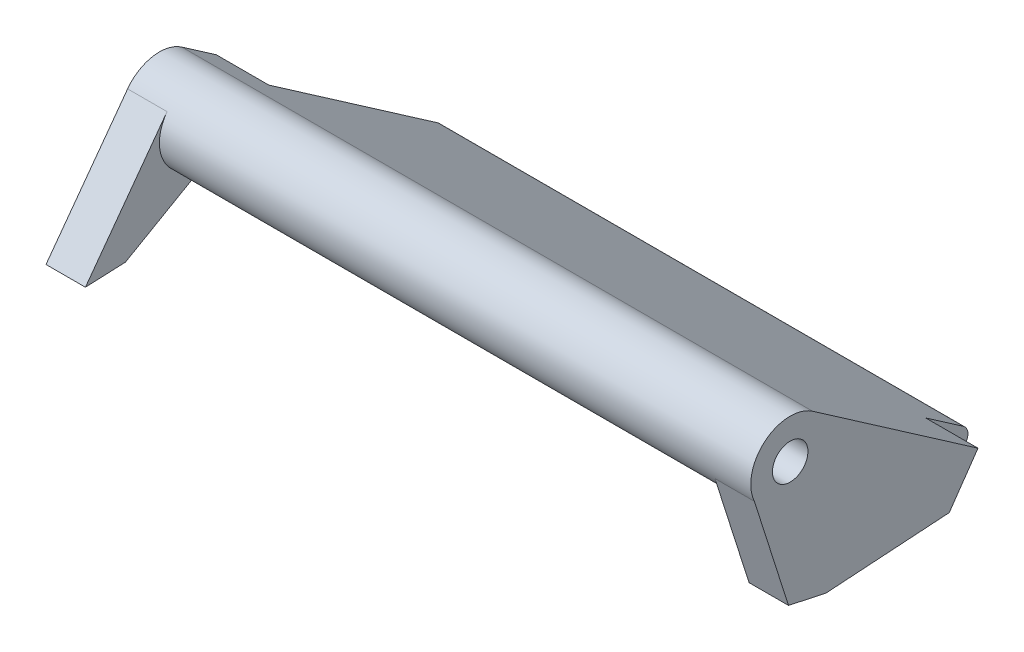
ISO-10303-21;
HEADER;
FILE_DESCRIPTION(('STEP AP214'),'2;1');
FILE_NAME('part.step','',(''),(''),'','','');
FILE_SCHEMA(('AUTOMOTIVE_DESIGN { 1 0 10303 214 1 1 1 1 }'));
ENDSEC;
DATA;
#1=APPLICATION_CONTEXT('core data for automotive mechanical design processes');
#2=APPLICATION_PROTOCOL_DEFINITION('international standard','automotive_design',2000,#1);
#3=PRODUCT_CONTEXT('',#1,'mechanical');
#4=PRODUCT('Part','Part','',(#3));
#5=PRODUCT_RELATED_PRODUCT_CATEGORY('part','',(#4));
#6=PRODUCT_DEFINITION_FORMATION('','',#4);
#7=PRODUCT_DEFINITION_CONTEXT('part definition',#1,'design');
#8=PRODUCT_DEFINITION('design','',#6,#7);
#9=PRODUCT_DEFINITION_SHAPE('','',#8);
#10=(LENGTH_UNIT() NAMED_UNIT(*) SI_UNIT(.MILLI.,.METRE.));
#11=(NAMED_UNIT(*) PLANE_ANGLE_UNIT() SI_UNIT($,.RADIAN.));
#12=(NAMED_UNIT(*) SI_UNIT($,.STERADIAN.) SOLID_ANGLE_UNIT());
#13=UNCERTAINTY_MEASURE_WITH_UNIT(LENGTH_MEASURE(1.E-05),#10,'distance_accuracy_value','');
#14=(GEOMETRIC_REPRESENTATION_CONTEXT(3) GLOBAL_UNCERTAINTY_ASSIGNED_CONTEXT((#13)) GLOBAL_UNIT_ASSIGNED_CONTEXT((#10,
#11,#12)) REPRESENTATION_CONTEXT('',''));
#15=CARTESIAN_POINT('',(0.,0.,0.));
#16=DIRECTION('',(0.,0.,1.));
#17=DIRECTION('',(1.,0.,0.));
#18=AXIS2_PLACEMENT_3D('',#15,#16,#17);
#19=CARTESIAN_POINT('',(10.0025786827693,10.,-13.1500803493484));
#20=DIRECTION('',(1.,0.,0.));
#21=DIRECTION('',(0.,0.,-1.));
#22=AXIS2_PLACEMENT_3D('',#19,#20,#21);
#23=PLANE('',#22);
#24=DIRECTION('',(0.,-0.56983363286526,-0.821760081079374));
#25=VECTOR('',#24,1.);
#26=CARTESIAN_POINT('',(10.0025786827693,1.23264012161906,-0.85475044929789));
#27=LINE('',#26,#25);
#28=CARTESIAN_POINT('',(10.0025786827693,-3.12994978908771,-7.14606432052765));
#29=VERTEX_POINT('',#28);
#30=CARTESIAN_POINT('',(10.0025786827693,-4.13032285767228,-8.58870758785487));
#31=VERTEX_POINT('',#30);
#32=EDGE_CURVE('E64',#29,#31,#27,.T.);
#33=ORIENTED_EDGE('',*,*,#32,.F.);
#34=DIRECTION('',(0.,0.821760081079374,-0.56983363286526));
#35=VECTOR('',#34,1.);
#36=CARTESIAN_POINT('',(10.0025786827693,-4.70678049005269,-6.05264157168332));
#37=LINE('',#36,#35);
#38=CARTESIAN_POINT('',(10.0025786827693,-3.74959196427246,-6.71638543992509));
#39=VERTEX_POINT('',#38);
#40=EDGE_CURVE('E68',#39,#29,#37,.T.);
#41=ORIENTED_EDGE('',*,*,#40,.F.);
#42=DIRECTION('',(0.,0.56983363286526,0.821760081079374));
#43=VECTOR('',#42,1.);
#44=CARTESIAN_POINT('',(10.0025786827693,0.612997946434314,-0.425071568695328));
#45=LINE('',#44,#43);
#46=CARTESIAN_POINT('',(10.0025786827693,-4.74996503285703,-8.15902870725231));
#47=VERTEX_POINT('',#46);
#48=EDGE_CURVE('E315',#47,#39,#45,.T.);
#49=ORIENTED_EDGE('',*,*,#48,.F.);
#50=CARTESIAN_POINT('',(10.0025786827693,-4.42126100042528,-8.38696216039841));
#51=DIRECTION('',(1.,0.,0.));
#52=DIRECTION('',(0.,0.,-1.));
#53=AXIS2_PLACEMENT_3D('',#50,#51,#52);
#54=CIRCLE('',#53,0.4);
#55=CARTESIAN_POINT('',(10.0025786827693,-4.66770098402796,-8.70202935082278));
#56=VERTEX_POINT('',#55);
#57=EDGE_CURVE('E57',#47,#56,#54,.T.);
#58=ORIENTED_EDGE('',*,*,#57,.T.);
#59=CARTESIAN_POINT('',(10.0025786827693,-4.45902689010403,-8.36077413470877));
#60=DIRECTION('',(1.,0.,0.));
#61=DIRECTION('',(0.,0.,-1.));
#62=AXIS2_PLACEMENT_3D('',#59,#60,#61);
#63=CIRCLE('',#62,0.4);
#64=EDGE_CURVE('E366',#56,#31,#63,.T.);
#65=ORIENTED_EDGE('',*,*,#64,.T.);
#66=EDGE_LOOP('',(#33,#41,#49,#58,#65));
#67=FACE_BOUND('',#66,.T.);
#68=ADVANCED_FACE('F47',(#67),#23,.T.);
#69=CARTESIAN_POINT('',(12.,0.612997946434314,-0.425071568695328));
#70=DIRECTION('',(0.,-0.821760081079374,0.56983363286526));
#71=DIRECTION('',(0.,-0.56983363286526,-0.821760081079374));
#72=AXIS2_PLACEMENT_3D('',#69,#70,#71);
#73=PLANE('',#72);
#74=DIRECTION('',(1.,0.,0.));
#75=VECTOR('',#74,1.);
#76=CARTESIAN_POINT('',(12.,-0.593999427107595,-2.16568883369787));
#77=LINE('',#76,#75);
#78=CARTESIAN_POINT('',(10.0025786827693,-0.593999427107595,-2.16568883369787));
#79=VERTEX_POINT('',#78);
#80=CARTESIAN_POINT('',(10.5,-0.593999427107594,-2.16568883369787));
#81=VERTEX_POINT('',#80);
#82=EDGE_CURVE('E311',#79,#81,#77,.T.);
#83=ORIENTED_EDGE('',*,*,#82,.T.);
#84=DIRECTION('',(0.,0.56983363286526,0.821760081079375));
#85=VECTOR('',#84,1.);
#86=CARTESIAN_POINT('',(10.5,-0.128562902088475,-1.49448037130188));
#87=LINE('',#86,#85);
#88=CARTESIAN_POINT('',(10.5,-0.128562902088475,-1.49448037130188));
#89=VERTEX_POINT('',#88);
#90=EDGE_CURVE('E235',#81,#89,#87,.T.);
#91=ORIENTED_EDGE('',*,*,#90,.T.);
#92=DIRECTION('',(-1.,0.,0.));
#93=VECTOR('',#92,1.);
#94=CARTESIAN_POINT('',(12.,-0.128562902088475,-1.49448037130188));
#95=LINE('',#94,#93);
#96=CARTESIAN_POINT('',(-12.,-0.128562902088475,-1.49448037130188));
#97=VERTEX_POINT('',#96);
#98=EDGE_CURVE('E334',#89,#97,#95,.T.);
#99=ORIENTED_EDGE('',*,*,#98,.T.);
#100=DIRECTION('',(0.,0.56983363286526,0.821760081079374));
#101=VECTOR('',#100,1.);
#102=CARTESIAN_POINT('',(-12.,0.612997946434314,-0.425071568695328));
#103=LINE('',#102,#101);
#104=CARTESIAN_POINT('',(-12.,-0.593999427107594,-2.16568883369787));
#105=VERTEX_POINT('',#104);
#106=EDGE_CURVE('E342',#105,#97,#103,.T.);
#107=ORIENTED_EDGE('',*,*,#106,.F.);
#108=DIRECTION('',(1.,0.,0.));
#109=VECTOR('',#108,1.);
#110=CARTESIAN_POINT('',(12.,-0.5939994271076,-2.16568883369788));
#111=LINE('',#110,#109);
#112=CARTESIAN_POINT('',(-10.0025786827693,-0.593999427107593,-2.16568883369787));
#113=VERTEX_POINT('',#112);
#114=EDGE_CURVE('E303',#105,#113,#111,.T.);
#115=ORIENTED_EDGE('',*,*,#114,.T.);
#116=DIRECTION('',(0.,-0.56983363286526,-0.821760081079374));
#117=VECTOR('',#116,1.);
#118=CARTESIAN_POINT('',(-10.0025786827693,0.612997946434316,-0.425071568695325));
#119=LINE('',#118,#117);
#120=CARTESIAN_POINT('',(-10.0025786827693,-4.74996503285703,-8.15902870725231));
#121=VERTEX_POINT('',#120);
#122=EDGE_CURVE('E320',#113,#121,#119,.T.);
#123=ORIENTED_EDGE('',*,*,#122,.T.);
#124=DIRECTION('',(-1.,0.,0.));
#125=VECTOR('',#124,1.);
#126=CARTESIAN_POINT('',(12.,-4.74996503285703,-8.15902870725231));
#127=LINE('',#126,#125);
#128=EDGE_CURVE('E362',#121,#47,#127,.F.);
#129=ORIENTED_EDGE('',*,*,#128,.T.);
#130=ORIENTED_EDGE('',*,*,#48,.T.);
#131=DIRECTION('',(0.,0.56983363286526,0.821760081079374));
#132=VECTOR('',#131,1.);
#133=CARTESIAN_POINT('',(10.0025786827693,0.612997946434314,-0.425071568695328));
#134=LINE('',#133,#132);
#135=EDGE_CURVE('E203',#39,#79,#134,.T.);
#136=ORIENTED_EDGE('',*,*,#135,.T.);
#137=EDGE_LOOP('',(#83,#91,#99,#107,#115,#123,#129,#130,#136));
#138=FACE_BOUND('',#137,.T.);
#139=ADVANCED_FACE('F394',(#138),#73,.T.);
#140=CARTESIAN_POINT('',(12.,0.,0.));
#141=DIRECTION('',(-1.,0.,0.));
#142=DIRECTION('',(0.,0.,1.));
#143=AXIS2_PLACEMENT_3D('',#140,#141,#142);
#144=CYLINDRICAL_SURFACE('',#143,1.5);
#145=CARTESIAN_POINT('',(10.5,0.,0.));
#146=DIRECTION('',(-1.,0.,0.));
#147=DIRECTION('',(0.,0.,-1.));
#148=AXIS2_PLACEMENT_3D('',#145,#146,#147);
#149=CIRCLE('',#148,1.5);
#150=CARTESIAN_POINT('',(10.5,-0.629342863678596,1.36159008513459));
#151=VERTEX_POINT('',#150);
#152=EDGE_CURVE('E216',#89,#151,#149,.T.);
#153=ORIENTED_EDGE('',*,*,#152,.T.);
#154=DIRECTION('',(1.,0.,0.));
#155=VECTOR('',#154,1.);
#156=CARTESIAN_POINT('',(10.5,-0.629342863678596,1.36159008513459));
#157=LINE('',#156,#155);
#158=CARTESIAN_POINT('',(12.,-0.629342863678601,1.36159008513459));
#159=VERTEX_POINT('',#158);
#160=EDGE_CURVE('E238',#151,#159,#157,.T.);
#161=ORIENTED_EDGE('',*,*,#160,.T.);
#162=CARTESIAN_POINT('',(12.,0.,0.));
#163=DIRECTION('',(1.,0.,0.));
#164=DIRECTION('',(0.,0.,-1.));
#165=AXIS2_PLACEMENT_3D('',#162,#163,#164);
#166=CIRCLE('',#165,1.5);
#167=CARTESIAN_POINT('',(12.,1.23264012161906,-0.85475044929789));
#168=VERTEX_POINT('',#167);
#169=EDGE_CURVE('E183',#168,#159,#166,.T.);
#170=ORIENTED_EDGE('',*,*,#169,.F.);
#171=DIRECTION('',(-1.,0.,0.));
#172=VECTOR('',#171,1.);
#173=CARTESIAN_POINT('',(12.,1.23264012161906,-0.85475044929789));
#174=LINE('',#173,#172);
#175=CARTESIAN_POINT('',(-12.,1.23264012161906,-0.85475044929789));
#176=VERTEX_POINT('',#175);
#177=EDGE_CURVE('E177',#168,#176,#174,.T.);
#178=ORIENTED_EDGE('',*,*,#177,.T.);
#179=CARTESIAN_POINT('',(-12.,0.,0.));
#180=DIRECTION('',(1.,0.,0.));
#181=DIRECTION('',(0.,0.,-1.));
#182=AXIS2_PLACEMENT_3D('',#179,#180,#181);
#183=CIRCLE('',#182,1.5);
#184=CARTESIAN_POINT('',(-12.,0.887142062973357,1.20953667166538));
#185=VERTEX_POINT('',#184);
#186=EDGE_CURVE('E339',#176,#185,#183,.T.);
#187=ORIENTED_EDGE('',*,*,#186,.T.);
#188=DIRECTION('',(-1.,0.,0.));
#189=VECTOR('',#188,1.);
#190=CARTESIAN_POINT('',(-10.5,0.887142062973357,1.20953667166539));
#191=LINE('',#190,#189);
#192=CARTESIAN_POINT('',(-10.5,0.887142062973357,1.20953667166539));
#193=VERTEX_POINT('',#192);
#194=EDGE_CURVE('E286',#193,#185,#191,.T.);
#195=ORIENTED_EDGE('',*,*,#194,.F.);
#196=CARTESIAN_POINT('',(-10.5,0.,0.));
#197=DIRECTION('',(1.,0.,0.));
#198=DIRECTION('',(0.,0.,1.));
#199=AXIS2_PLACEMENT_3D('',#196,#197,#198);
#200=CIRCLE('',#199,1.5);
#201=CARTESIAN_POINT('',(-10.5,-1.4412068388642,-0.41583993027494));
#202=VERTEX_POINT('',#201);
#203=EDGE_CURVE('E258',#193,#202,#200,.T.);
#204=ORIENTED_EDGE('',*,*,#203,.T.);
#205=DIRECTION('',(-1.,0.,0.));
#206=VECTOR('',#205,1.);
#207=CARTESIAN_POINT('',(-10.5,-1.4412068388642,-0.41583993027494));
#208=LINE('',#207,#206);
#209=CARTESIAN_POINT('',(-12.,-1.4412068388642,-0.41583993027494));
#210=VERTEX_POINT('',#209);
#211=EDGE_CURVE('E274',#202,#210,#208,.T.);
#212=ORIENTED_EDGE('',*,*,#211,.T.);
#213=EDGE_CURVE('E338',#210,#97,#183,.T.);
#214=ORIENTED_EDGE('',*,*,#213,.T.);
#215=ORIENTED_EDGE('',*,*,#98,.F.);
#216=EDGE_LOOP('',(#153,#161,#170,#178,#187,#195,#204,#212,#214,#215));
#217=FACE_BOUND('',#216,.T.);
#218=ADVANCED_FACE('F385',(#217),#144,.T.);
#219=CARTESIAN_POINT('',(12.,1.23264012161906,-0.85475044929789));
#220=DIRECTION('',(0.,0.821760081079374,-0.56983363286526));
#221=DIRECTION('',(0.,0.56983363286526,0.821760081079374));
#222=AXIS2_PLACEMENT_3D('',#219,#220,#221);
#223=PLANE('',#222);
#224=DIRECTION('',(-1.,0.,0.));
#225=VECTOR('',#224,1.);
#226=CARTESIAN_POINT('',(19.0787583757015,-3.12994978908771,-7.14606432052765));
#227=LINE('',#226,#225);
#228=CARTESIAN_POINT('',(12.,-3.12994978908771,-7.14606432052765));
#229=VERTEX_POINT('',#228);
#230=EDGE_CURVE('E175',#229,#29,#227,.T.);
#231=ORIENTED_EDGE('',*,*,#230,.T.);
#232=ORIENTED_EDGE('',*,*,#32,.T.);
#233=DIRECTION('',(-1.,0.,0.));
#234=VECTOR('',#233,1.);
#235=CARTESIAN_POINT('',(12.,-4.13032285767228,-8.58870758785487));
#236=LINE('',#235,#234);
#237=CARTESIAN_POINT('',(-10.0025786827693,-4.13032285767228,-8.58870758785487));
#238=VERTEX_POINT('',#237);
#239=EDGE_CURVE('E11',#31,#238,#236,.T.);
#240=ORIENTED_EDGE('',*,*,#239,.T.);
#241=DIRECTION('',(0.,0.56983363286526,0.821760081079374));
#242=VECTOR('',#241,1.);
#243=CARTESIAN_POINT('',(-10.0025786827693,1.23264012161906,-0.854750449297888));
#244=LINE('',#243,#242);
#245=CARTESIAN_POINT('',(-10.0025786827693,0.323595256524185,-2.16568883369787));
#246=VERTEX_POINT('',#245);
#247=EDGE_CURVE('E324',#238,#246,#244,.T.);
#248=ORIENTED_EDGE('',*,*,#247,.T.);
#249=DIRECTION('',(-1.,0.,0.));
#250=VECTOR('',#249,1.);
#251=CARTESIAN_POINT('',(12.,0.32359525652418,-2.16568883369788));
#252=LINE('',#251,#250);
#253=CARTESIAN_POINT('',(-12.,0.323595256524186,-2.16568883369787));
#254=VERTEX_POINT('',#253);
#255=EDGE_CURVE('E307',#246,#254,#252,.T.);
#256=ORIENTED_EDGE('',*,*,#255,.T.);
#257=DIRECTION('',(0.,-0.56983363286526,-0.821760081079374));
#258=VECTOR('',#257,1.);
#259=CARTESIAN_POINT('',(-12.,1.23264012161906,-0.85475044929789));
#260=LINE('',#259,#258);
#261=EDGE_CURVE('E326',#176,#254,#260,.T.);
#262=ORIENTED_EDGE('',*,*,#261,.F.);
#263=ORIENTED_EDGE('',*,*,#177,.F.);
#264=DIRECTION('',(0.,-0.56983363286526,-0.821760081079374));
#265=VECTOR('',#264,1.);
#266=CARTESIAN_POINT('',(12.,1.23264012161906,-0.85475044929789));
#267=LINE('',#266,#265);
#268=EDGE_CURVE('E172',#168,#229,#267,.T.);
#269=ORIENTED_EDGE('',*,*,#268,.T.);
#270=EDGE_LOOP('',(#231,#232,#240,#248,#256,#262,#263,#269));
#271=FACE_BOUND('',#270,.T.);
#272=ADVANCED_FACE('F174',(#271),#223,.T.);
#273=CARTESIAN_POINT('',(12.,0.,0.));
#274=DIRECTION('',(1.,0.,0.));
#275=DIRECTION('',(0.,0.,-1.));
#276=AXIS2_PLACEMENT_3D('',#273,#274,#275);
#277=PLANE('',#276);
#278=DIRECTION('',(0.,0.821760081079374,-0.56983363286526));
#279=VECTOR('',#278,1.);
#280=CARTESIAN_POINT('',(12.,-4.70678049005269,-6.05264157168332));
#281=LINE('',#280,#279);
#282=CARTESIAN_POINT('',(12.,-4.70678049005269,-6.05264157168332));
#283=VERTEX_POINT('',#282);
#284=EDGE_CURVE('E190',#283,#229,#281,.T.);
#285=ORIENTED_EDGE('',*,*,#284,.T.);
#286=ORIENTED_EDGE('',*,*,#268,.F.);
#287=ORIENTED_EDGE('',*,*,#169,.T.);
#288=DIRECTION('',(0.,-0.952962001158608,-0.303089795848989));
#289=VECTOR('',#288,1.);
#290=CARTESIAN_POINT('',(12.,-0.629342863678596,1.36159008513459));
#291=LINE('',#290,#289);
#292=CARTESIAN_POINT('',(12.,-4.70678049005269,0.0647600580588064));
#293=VERTEX_POINT('',#292);
#294=EDGE_CURVE('E207',#159,#293,#291,.T.);
#295=ORIENTED_EDGE('',*,*,#294,.T.);
#296=DIRECTION('',(0.,-0.211123507645692,-0.9774593927726));
#297=VECTOR('',#296,1.);
#298=CARTESIAN_POINT('',(12.,-4.70678049005269,0.0647600580588064));
#299=LINE('',#298,#297);
#300=CARTESIAN_POINT('',(12.,-5.01416057726156,-1.35834794513801));
#301=VERTEX_POINT('',#300);
#302=EDGE_CURVE('E242',#293,#301,#299,.T.);
#303=ORIENTED_EDGE('',*,*,#302,.T.);
#304=DIRECTION('',(0.,0.0653395945464725,-0.997863085490441));
#305=VECTOR('',#304,1.);
#306=CARTESIAN_POINT('',(12.,-4.70678049005269,-6.05264157168332));
#307=LINE('',#306,#305);
#308=EDGE_CURVE('E201',#301,#283,#307,.T.);
#309=ORIENTED_EDGE('',*,*,#308,.T.);
#310=EDGE_LOOP('',(#285,#286,#287,#295,#303,#309));
#311=FACE_BOUND('',#310,.T.);
#312=CARTESIAN_POINT('',(12.,0.,0.));
#313=DIRECTION('',(1.,0.,0.));
#314=DIRECTION('',(0.,0.,-1.));
#315=AXIS2_PLACEMENT_3D('',#312,#313,#314);
#316=CIRCLE('',#315,0.675);
#317=CARTESIAN_POINT('',(12.,0.,-0.675));
#318=VERTEX_POINT('',#317);
#319=EDGE_CURVE('E330',#318,#318,#316,.T.);
#320=ORIENTED_EDGE('',*,*,#319,.F.);
#321=EDGE_LOOP('',(#320));
#322=FACE_BOUND('',#321,.T.);
#323=ADVANCED_FACE('F197',(#311,#322),#277,.T.);
#324=CARTESIAN_POINT('',(-12.,0.,0.));
#325=DIRECTION('',(1.,0.,0.));
#326=DIRECTION('',(0.,0.,-1.));
#327=AXIS2_PLACEMENT_3D('',#324,#325,#326);
#328=PLANE('',#327);
#329=CARTESIAN_POINT('',(-12.,0.,0.));
#330=DIRECTION('',(1.,0.,0.));
#331=DIRECTION('',(0.,0.,-1.));
#332=AXIS2_PLACEMENT_3D('',#329,#330,#331);
#333=CIRCLE('',#332,0.675);
#334=CARTESIAN_POINT('',(-12.,0.,-0.675));
#335=VERTEX_POINT('',#334);
#336=EDGE_CURVE('E184',#335,#335,#333,.T.);
#337=ORIENTED_EDGE('',*,*,#336,.T.);
#338=EDGE_LOOP('',(#337));
#339=FACE_BOUND('',#338,.T.);
#340=DIRECTION('',(0.,1.,0.));
#341=VECTOR('',#340,1.);
#342=CARTESIAN_POINT('',(-12.,0.,-2.16568883369787));
#343=LINE('',#342,#341);
#344=EDGE_CURVE('E353',#105,#254,#343,.T.);
#345=ORIENTED_EDGE('',*,*,#344,.F.);
#346=ORIENTED_EDGE('',*,*,#106,.T.);
#347=ORIENTED_EDGE('',*,*,#213,.F.);
#348=DIRECTION('',(0.,-0.497738893826087,0.86732692427526));
#349=VECTOR('',#348,1.);
#350=CARTESIAN_POINT('',(-12.,-3.28158078622837,2.79107416682073));
#351=LINE('',#350,#349);
#352=CARTESIAN_POINT('',(-12.,-3.28158078622837,2.79107416682073));
#353=VERTEX_POINT('',#352);
#354=EDGE_CURVE('E275',#210,#353,#351,.T.);
#355=ORIENTED_EDGE('',*,*,#354,.T.);
#356=DIRECTION('',(0.,-0.0428582006303218,0.999081165190662));
#357=VECTOR('',#356,1.);
#358=CARTESIAN_POINT('',(-12.,-3.34695622908927,4.31506193736941));
#359=LINE('',#358,#357);
#360=CARTESIAN_POINT('',(-12.,-3.34695622908927,4.31506193736941));
#361=VERTEX_POINT('',#360);
#362=EDGE_CURVE('E279',#353,#361,#359,.T.);
#363=ORIENTED_EDGE('',*,*,#362,.T.);
#364=DIRECTION('',(0.,0.806357781110256,-0.591428041982238));
#365=VECTOR('',#364,1.);
#366=CARTESIAN_POINT('',(-12.,0.887142062973357,1.20953667166539));
#367=LINE('',#366,#365);
#368=EDGE_CURVE('E262',#361,#185,#367,.T.);
#369=ORIENTED_EDGE('',*,*,#368,.T.);
#370=ORIENTED_EDGE('',*,*,#186,.F.);
#371=ORIENTED_EDGE('',*,*,#261,.T.);
#372=EDGE_LOOP('',(#345,#346,#347,#355,#363,#369,#370,#371));
#373=FACE_BOUND('',#372,.T.);
#374=ADVANCED_FACE('F392',(#339,#373),#328,.F.);
#375=CARTESIAN_POINT('',(12.,0.,0.));
#376=DIRECTION('',(-1.,0.,0.));
#377=DIRECTION('',(0.,0.,1.));
#378=AXIS2_PLACEMENT_3D('',#375,#376,#377);
#379=CYLINDRICAL_SURFACE('',#378,0.675);
#380=ORIENTED_EDGE('',*,*,#319,.T.);
#381=EDGE_LOOP('',(#380));
#382=FACE_BOUND('',#381,.T.);
#383=ORIENTED_EDGE('',*,*,#336,.F.);
#384=EDGE_LOOP('',(#383));
#385=FACE_BOUND('',#384,.T.);
#386=ADVANCED_FACE('F448',(#382,#385),#379,.F.);
#387=CARTESIAN_POINT('',(-10.0025786827693,10.,-2.16568883369787));
#388=DIRECTION('',(0.,0.,-1.));
#389=DIRECTION('',(-1.,0.,0.));
#390=AXIS2_PLACEMENT_3D('',#387,#388,#389);
#391=PLANE('',#390);
#392=DIRECTION('',(0.,-1.,0.));
#393=VECTOR('',#392,1.);
#394=CARTESIAN_POINT('',(-10.0025786827693,10.,-2.16568883369787));
#395=LINE('',#394,#393);
#396=EDGE_CURVE('E290',#246,#113,#395,.T.);
#397=ORIENTED_EDGE('',*,*,#396,.T.);
#398=ORIENTED_EDGE('',*,*,#114,.F.);
#399=ORIENTED_EDGE('',*,*,#344,.T.);
#400=ORIENTED_EDGE('',*,*,#255,.F.);
#401=EDGE_LOOP('',(#397,#398,#399,#400));
#402=FACE_BOUND('',#401,.T.);
#403=ADVANCED_FACE('F412',(#402),#391,.T.);
#404=CARTESIAN_POINT('',(-10.0025786827693,10.,-13.1500803493484));
#405=DIRECTION('',(-1.,0.,0.));
#406=DIRECTION('',(0.,0.,1.));
#407=AXIS2_PLACEMENT_3D('',#404,#405,#406);
#408=PLANE('',#407);
#409=CARTESIAN_POINT('',(-10.0025786827693,-4.45902689010403,-8.36077413470877));
#410=DIRECTION('',(-1.,0.,0.));
#411=DIRECTION('',(0.,0.,1.));
#412=AXIS2_PLACEMENT_3D('',#409,#410,#411);
#413=CIRCLE('',#412,0.4);
#414=CARTESIAN_POINT('',(-10.0025786827693,-4.66770098402796,-8.70202935082278));
#415=VERTEX_POINT('',#414);
#416=EDGE_CURVE('E356',#238,#415,#413,.T.);
#417=ORIENTED_EDGE('',*,*,#416,.T.);
#418=CARTESIAN_POINT('',(-10.0025786827693,-4.42126100042528,-8.38696216039841));
#419=DIRECTION('',(-1.,0.,0.));
#420=DIRECTION('',(0.,0.,1.));
#421=AXIS2_PLACEMENT_3D('',#418,#419,#420);
#422=CIRCLE('',#421,0.4);
#423=EDGE_CURVE('E359',#415,#121,#422,.T.);
#424=ORIENTED_EDGE('',*,*,#423,.T.);
#425=ORIENTED_EDGE('',*,*,#122,.F.);
#426=ORIENTED_EDGE('',*,*,#396,.F.);
#427=ORIENTED_EDGE('',*,*,#247,.F.);
#428=EDGE_LOOP('',(#417,#424,#425,#426,#427));
#429=FACE_BOUND('',#428,.T.);
#430=ADVANCED_FACE('F414',(#429),#408,.T.);
#431=CARTESIAN_POINT('',(-10.5,0.887142062973357,1.20953667166539));
#432=DIRECTION('',(0.,0.591428041982238,0.806357781110256));
#433=DIRECTION('',(0.,-0.806357781110256,0.591428041982238));
#434=AXIS2_PLACEMENT_3D('',#431,#432,#433);
#435=PLANE('',#434);
#436=ORIENTED_EDGE('',*,*,#368,.F.);
#437=DIRECTION('',(-1.,0.,0.));
#438=VECTOR('',#437,1.);
#439=CARTESIAN_POINT('',(-10.5,-3.34695622908927,4.31506193736941));
#440=LINE('',#439,#438);
#441=CARTESIAN_POINT('',(-10.5,-3.34695622908927,4.31506193736941));
#442=VERTEX_POINT('',#441);
#443=EDGE_CURVE('E291',#442,#361,#440,.T.);
#444=ORIENTED_EDGE('',*,*,#443,.F.);
#445=DIRECTION('',(0.,0.806357781110256,-0.591428041982238));
#446=VECTOR('',#445,1.);
#447=CARTESIAN_POINT('',(-10.5,0.887142062973357,1.20953667166539));
#448=LINE('',#447,#446);
#449=EDGE_CURVE('E270',#442,#193,#448,.T.);
#450=ORIENTED_EDGE('',*,*,#449,.T.);
#451=ORIENTED_EDGE('',*,*,#194,.T.);
#452=EDGE_LOOP('',(#436,#444,#450,#451));
#453=FACE_BOUND('',#452,.T.);
#454=ADVANCED_FACE('F483',(#453),#435,.T.);
#455=CARTESIAN_POINT('',(-10.5,-3.34695622908927,4.31506193736941));
#456=DIRECTION('',(0.,-0.999081165190662,-0.0428582006303218));
#457=DIRECTION('',(0.,0.0428582006303218,-0.999081165190662));
#458=AXIS2_PLACEMENT_3D('',#455,#456,#457);
#459=PLANE('',#458);
#460=ORIENTED_EDGE('',*,*,#362,.F.);
#461=DIRECTION('',(-1.,0.,0.));
#462=VECTOR('',#461,1.);
#463=CARTESIAN_POINT('',(-10.5,-3.28158078622837,2.79107416682073));
#464=LINE('',#463,#462);
#465=CARTESIAN_POINT('',(-10.5,-3.28158078622837,2.79107416682073));
#466=VERTEX_POINT('',#465);
#467=EDGE_CURVE('E294',#466,#353,#464,.T.);
#468=ORIENTED_EDGE('',*,*,#467,.F.);
#469=DIRECTION('',(0.,-0.0428582006303218,0.999081165190662));
#470=VECTOR('',#469,1.);
#471=CARTESIAN_POINT('',(-10.5,-3.34695622908927,4.31506193736941));
#472=LINE('',#471,#470);
#473=EDGE_CURVE('E266',#466,#442,#472,.T.);
#474=ORIENTED_EDGE('',*,*,#473,.T.);
#475=ORIENTED_EDGE('',*,*,#443,.T.);
#476=EDGE_LOOP('',(#460,#468,#474,#475));
#477=FACE_BOUND('',#476,.T.);
#478=ADVANCED_FACE('F476',(#477),#459,.T.);
#479=CARTESIAN_POINT('',(-10.5,-3.28158078622837,2.79107416682073));
#480=DIRECTION('',(0.,-0.86732692427526,-0.497738893826087));
#481=DIRECTION('',(0.,0.497738893826087,-0.86732692427526));
#482=AXIS2_PLACEMENT_3D('',#479,#480,#481);
#483=PLANE('',#482);
#484=ORIENTED_EDGE('',*,*,#354,.F.);
#485=ORIENTED_EDGE('',*,*,#211,.F.);
#486=DIRECTION('',(0.,-0.497738893826087,0.86732692427526));
#487=VECTOR('',#486,1.);
#488=CARTESIAN_POINT('',(-10.5,-3.28158078622837,2.79107416682073));
#489=LINE('',#488,#487);
#490=EDGE_CURVE('E261',#202,#466,#489,.T.);
#491=ORIENTED_EDGE('',*,*,#490,.T.);
#492=ORIENTED_EDGE('',*,*,#467,.T.);
#493=EDGE_LOOP('',(#484,#485,#491,#492));
#494=FACE_BOUND('',#493,.T.);
#495=ADVANCED_FACE('F470',(#494),#483,.T.);
#496=CARTESIAN_POINT('',(-10.5,0.,0.));
#497=DIRECTION('',(-1.,0.,0.));
#498=DIRECTION('',(0.,0.,1.));
#499=AXIS2_PLACEMENT_3D('',#496,#497,#498);
#500=PLANE('',#499);
#501=ORIENTED_EDGE('',*,*,#203,.F.);
#502=ORIENTED_EDGE('',*,*,#449,.F.);
#503=ORIENTED_EDGE('',*,*,#473,.F.);
#504=ORIENTED_EDGE('',*,*,#490,.F.);
#505=EDGE_LOOP('',(#501,#502,#503,#504));
#506=FACE_BOUND('',#505,.T.);
#507=ADVANCED_FACE('F465',(#506),#500,.F.);
#508=CARTESIAN_POINT('',(12.,-4.45902689010403,-8.36077413470877));
#509=DIRECTION('',(-1.,0.,0.));
#510=DIRECTION('',(0.,0.,1.));
#511=AXIS2_PLACEMENT_3D('',#508,#509,#510);
#512=CYLINDRICAL_SURFACE('',#511,0.4);
#513=ORIENTED_EDGE('',*,*,#239,.F.);
#514=ORIENTED_EDGE('',*,*,#64,.F.);
#515=DIRECTION('',(-1.,0.,0.));
#516=VECTOR('',#515,1.);
#517=CARTESIAN_POINT('',(0.,-4.66770098402796,-8.70202935082278));
#518=LINE('',#517,#516);
#519=EDGE_CURVE('E51',#415,#56,#518,.F.);
#520=ORIENTED_EDGE('',*,*,#519,.F.);
#521=ORIENTED_EDGE('',*,*,#416,.F.);
#522=EDGE_LOOP('',(#513,#514,#520,#521));
#523=FACE_BOUND('',#522,.T.);
#524=ADVANCED_FACE('F49',(#523),#512,.T.);
#525=CARTESIAN_POINT('',(12.,-4.42126100042528,-8.38696216039841));
#526=DIRECTION('',(-1.,0.,0.));
#527=DIRECTION('',(0.,0.,1.));
#528=AXIS2_PLACEMENT_3D('',#525,#526,#527);
#529=CYLINDRICAL_SURFACE('',#528,0.4);
#530=ORIENTED_EDGE('',*,*,#57,.F.);
#531=ORIENTED_EDGE('',*,*,#128,.F.);
#532=ORIENTED_EDGE('',*,*,#423,.F.);
#533=ORIENTED_EDGE('',*,*,#519,.T.);
#534=EDGE_LOOP('',(#530,#531,#532,#533));
#535=FACE_BOUND('',#534,.T.);
#536=ADVANCED_FACE('F379',(#535),#529,.T.);
#537=CARTESIAN_POINT('',(10.5,-4.70678049005269,-6.05264157168332));
#538=DIRECTION('',(0.,-0.997863085490441,-0.0653395945464725));
#539=DIRECTION('',(0.,0.0653395945464725,-0.997863085490441));
#540=AXIS2_PLACEMENT_3D('',#537,#538,#539);
#541=PLANE('',#540);
#542=ORIENTED_EDGE('',*,*,#308,.F.);
#543=DIRECTION('',(1.,0.,0.));
#544=VECTOR('',#543,1.);
#545=CARTESIAN_POINT('',(10.5,-5.01416057726156,-1.35834794513801));
#546=LINE('',#545,#544);
#547=CARTESIAN_POINT('',(10.5,-5.01416057726156,-1.35834794513801));
#548=VERTEX_POINT('',#547);
#549=EDGE_CURVE('E250',#548,#301,#546,.T.);
#550=ORIENTED_EDGE('',*,*,#549,.F.);
#551=DIRECTION('',(0.,0.0653395945464725,-0.997863085490441));
#552=VECTOR('',#551,1.);
#553=CARTESIAN_POINT('',(10.5,-4.70678049005269,-6.05264157168332));
#554=LINE('',#553,#552);
#555=CARTESIAN_POINT('',(10.5,-4.70678049005269,-6.05264157168332));
#556=VERTEX_POINT('',#555);
#557=EDGE_CURVE('E227',#548,#556,#554,.T.);
#558=ORIENTED_EDGE('',*,*,#557,.T.);
#559=DIRECTION('',(1.,0.,0.));
#560=VECTOR('',#559,1.);
#561=CARTESIAN_POINT('',(10.5,-4.70678049005269,-6.05264157168332));
#562=LINE('',#561,#560);
#563=EDGE_CURVE('E247',#556,#283,#562,.T.);
#564=ORIENTED_EDGE('',*,*,#563,.T.);
#565=EDGE_LOOP('',(#542,#550,#558,#564));
#566=FACE_BOUND('',#565,.T.);
#567=ADVANCED_FACE('F457',(#566),#541,.T.);
#568=CARTESIAN_POINT('',(10.5,-4.70678049005269,0.0647600580588064));
#569=DIRECTION('',(0.,-0.9774593927726,0.211123507645692));
#570=DIRECTION('',(0.,-0.211123507645692,-0.9774593927726));
#571=AXIS2_PLACEMENT_3D('',#568,#569,#570);
#572=PLANE('',#571);
#573=ORIENTED_EDGE('',*,*,#302,.F.);
#574=DIRECTION('',(1.,0.,0.));
#575=VECTOR('',#574,1.);
#576=CARTESIAN_POINT('',(10.5,-4.70678049005269,0.0647600580588064));
#577=LINE('',#576,#575);
#578=CARTESIAN_POINT('',(10.5,-4.70678049005269,0.0647600580588064));
#579=VERTEX_POINT('',#578);
#580=EDGE_CURVE('E253',#579,#293,#577,.T.);
#581=ORIENTED_EDGE('',*,*,#580,.F.);
#582=DIRECTION('',(0.,-0.211123507645692,-0.9774593927726));
#583=VECTOR('',#582,1.);
#584=CARTESIAN_POINT('',(10.5,-4.70678049005269,0.0647600580588064));
#585=LINE('',#584,#583);
#586=EDGE_CURVE('E223',#579,#548,#585,.T.);
#587=ORIENTED_EDGE('',*,*,#586,.T.);
#588=ORIENTED_EDGE('',*,*,#549,.T.);
#589=EDGE_LOOP('',(#573,#581,#587,#588));
#590=FACE_BOUND('',#589,.T.);
#591=ADVANCED_FACE('F462',(#590),#572,.T.);
#592=CARTESIAN_POINT('',(10.5,-0.629342863678596,1.36159008513459));
#593=DIRECTION('',(0.,-0.303089795848989,0.952962001158608));
#594=DIRECTION('',(0.,-0.952962001158608,-0.303089795848989));
#595=AXIS2_PLACEMENT_3D('',#592,#593,#594);
#596=PLANE('',#595);
#597=ORIENTED_EDGE('',*,*,#294,.F.);
#598=ORIENTED_EDGE('',*,*,#160,.F.);
#599=DIRECTION('',(0.,-0.952962001158608,-0.303089795848989));
#600=VECTOR('',#599,1.);
#601=CARTESIAN_POINT('',(10.5,-0.629342863678596,1.36159008513459));
#602=LINE('',#601,#600);
#603=EDGE_CURVE('E219',#151,#579,#602,.T.);
#604=ORIENTED_EDGE('',*,*,#603,.T.);
#605=ORIENTED_EDGE('',*,*,#580,.T.);
#606=EDGE_LOOP('',(#597,#598,#604,#605));
#607=FACE_BOUND('',#606,.T.);
#608=ADVANCED_FACE('F404',(#607),#596,.T.);
#609=CARTESIAN_POINT('',(10.5,0.,0.));
#610=DIRECTION('',(1.,0.,0.));
#611=DIRECTION('',(0.,0.,-1.));
#612=AXIS2_PLACEMENT_3D('',#609,#610,#611);
#613=PLANE('',#612);
#614=ORIENTED_EDGE('',*,*,#152,.F.);
#615=ORIENTED_EDGE('',*,*,#90,.F.);
#616=DIRECTION('',(0.,0.726778509377624,0.686871893664925));
#617=VECTOR('',#616,1.);
#618=CARTESIAN_POINT('',(10.5,-0.593999427107594,-2.16568883369787));
#619=LINE('',#618,#617);
#620=EDGE_CURVE('E231',#556,#81,#619,.T.);
#621=ORIENTED_EDGE('',*,*,#620,.F.);
#622=ORIENTED_EDGE('',*,*,#557,.F.);
#623=ORIENTED_EDGE('',*,*,#586,.F.);
#624=ORIENTED_EDGE('',*,*,#603,.F.);
#625=EDGE_LOOP('',(#614,#615,#621,#622,#623,#624));
#626=FACE_BOUND('',#625,.T.);
#627=ADVANCED_FACE('F397',(#626),#613,.F.);
#628=CARTESIAN_POINT('',(19.0787583757015,-4.70678049005269,-6.05264157168332));
#629=DIRECTION('',(0.,0.686871893664925,-0.726778509377624));
#630=DIRECTION('',(0.,0.726778509377624,0.686871893664925));
#631=AXIS2_PLACEMENT_3D('',#628,#629,#630);
#632=PLANE('',#631);
#633=DIRECTION('',(-1.,0.,0.));
#634=VECTOR('',#633,1.);
#635=CARTESIAN_POINT('',(19.0787583757015,-4.70678049005269,-6.05264157168332));
#636=LINE('',#635,#634);
#637=CARTESIAN_POINT('',(10.0025786827693,-4.70678049005269,-6.05264157168332));
#638=VERTEX_POINT('',#637);
#639=EDGE_CURVE('E213',#556,#638,#636,.T.);
#640=ORIENTED_EDGE('',*,*,#639,.F.);
#641=ORIENTED_EDGE('',*,*,#620,.T.);
#642=ORIENTED_EDGE('',*,*,#82,.F.);
#643=DIRECTION('',(0.,-0.726778509377624,-0.686871893664925));
#644=VECTOR('',#643,1.);
#645=CARTESIAN_POINT('',(10.0025786827693,-4.70678049005269,-6.05264157168332));
#646=LINE('',#645,#644);
#647=EDGE_CURVE('E193',#79,#638,#646,.T.);
#648=ORIENTED_EDGE('',*,*,#647,.T.);
#649=EDGE_LOOP('',(#640,#641,#642,#648));
#650=FACE_BOUND('',#649,.T.);
#651=ADVANCED_FACE('F424',(#650),#632,.F.);
#652=CARTESIAN_POINT('',(19.0787583757015,-4.70678049005269,-6.05264157168332));
#653=DIRECTION('',(0.,0.56983363286526,0.821760081079374));
#654=DIRECTION('',(0.,-0.821760081079374,0.56983363286526));
#655=AXIS2_PLACEMENT_3D('',#652,#653,#654);
#656=PLANE('',#655);
#657=ORIENTED_EDGE('',*,*,#284,.F.);
#658=ORIENTED_EDGE('',*,*,#563,.F.);
#659=ORIENTED_EDGE('',*,*,#639,.T.);
#660=EDGE_CURVE('E194',#638,#39,#37,.T.);
#661=ORIENTED_EDGE('',*,*,#660,.T.);
#662=ORIENTED_EDGE('',*,*,#40,.T.);
#663=ORIENTED_EDGE('',*,*,#230,.F.);
#664=EDGE_LOOP('',(#657,#658,#659,#661,#662,#663));
#665=FACE_BOUND('',#664,.T.);
#666=ADVANCED_FACE('F188',(#665),#656,.F.);
#667=CARTESIAN_POINT('',(10.0025786827693,0.,0.));
#668=DIRECTION('',(1.,0.,0.));
#669=DIRECTION('',(0.,0.,-1.));
#670=AXIS2_PLACEMENT_3D('',#667,#668,#669);
#671=PLANE('',#670);
#672=ORIENTED_EDGE('',*,*,#135,.F.);
#673=ORIENTED_EDGE('',*,*,#660,.F.);
#674=ORIENTED_EDGE('',*,*,#647,.F.);
#675=EDGE_LOOP('',(#672,#673,#674));
#676=FACE_BOUND('',#675,.T.);
#677=ADVANCED_FACE('F419',(#676),#671,.F.);
#678=CLOSED_SHELL('',(#68,#139,#218,#272,#323,#374,#386,#403,#430,#454,#478,#495,#507,#524,#536,
#567,#591,#608,#627,#651,#666,#677));
#679=MANIFOLD_SOLID_BREP('B2',#678);
#680=ADVANCED_BREP_SHAPE_REPRESENTATION('',(#18,#679),#14);
#681=SHAPE_DEFINITION_REPRESENTATION(#9,#680);
ENDSEC;
END-ISO-10303-21;
